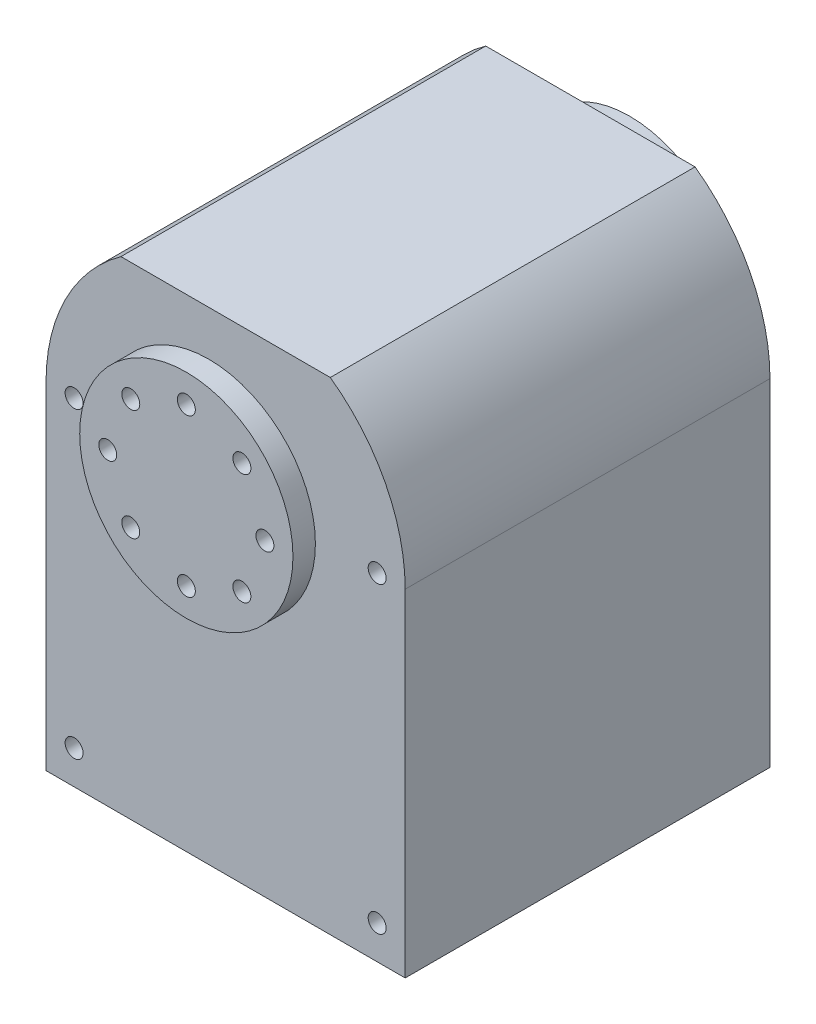
ISO-10303-21;
HEADER;
FILE_DESCRIPTION(('STEP AP214'),'2;1');
FILE_NAME('part.step','',(''),(''),'','','');
FILE_SCHEMA(('AUTOMOTIVE_DESIGN { 1 0 10303 214 1 1 1 1 }'));
ENDSEC;
DATA;
#1=APPLICATION_CONTEXT('core data for automotive mechanical design processes');
#2=APPLICATION_PROTOCOL_DEFINITION('international standard','automotive_design',2000,#1);
#3=PRODUCT_CONTEXT('',#1,'mechanical');
#4=PRODUCT('Part','Part','',(#3));
#5=PRODUCT_RELATED_PRODUCT_CATEGORY('part','',(#4));
#6=PRODUCT_DEFINITION_FORMATION('','',#4);
#7=PRODUCT_DEFINITION_CONTEXT('part definition',#1,'design');
#8=PRODUCT_DEFINITION('design','',#6,#7);
#9=PRODUCT_DEFINITION_SHAPE('','',#8);
#10=(LENGTH_UNIT() NAMED_UNIT(*) SI_UNIT(.MILLI.,.METRE.));
#11=(NAMED_UNIT(*) PLANE_ANGLE_UNIT() SI_UNIT($,.RADIAN.));
#12=(NAMED_UNIT(*) SI_UNIT($,.STERADIAN.) SOLID_ANGLE_UNIT());
#13=UNCERTAINTY_MEASURE_WITH_UNIT(LENGTH_MEASURE(1.E-05),#10,'distance_accuracy_value','');
#14=(GEOMETRIC_REPRESENTATION_CONTEXT(3) GLOBAL_UNCERTAINTY_ASSIGNED_CONTEXT((#13)) GLOBAL_UNIT_ASSIGNED_CONTEXT((#10,
#11,#12)) REPRESENTATION_CONTEXT('',''));
#15=CARTESIAN_POINT('',(0.,0.,0.));
#16=DIRECTION('',(0.,0.,1.));
#17=DIRECTION('',(1.,0.,0.));
#18=AXIS2_PLACEMENT_3D('',#15,#16,#17);
#19=CARTESIAN_POINT('',(0.,15.,32.5));
#20=DIRECTION('',(0.,0.,-1.));
#21=DIRECTION('',(-1.,0.,0.));
#22=AXIS2_PLACEMENT_3D('',#19,#20,#21);
#23=PLANE('',#22);
#24=CARTESIAN_POINT('',(0.,16.,32.5));
#25=DIRECTION('',(0.,0.,-1.));
#26=DIRECTION('',(-1.,0.,0.));
#27=AXIS2_PLACEMENT_3D('',#24,#25,#26);
#28=CIRCLE('',#27,4.5);
#29=CARTESIAN_POINT('',(-4.5,16.,32.5));
#30=VERTEX_POINT('',#29);
#31=EDGE_CURVE('E352',#30,#30,#28,.T.);
#32=ORIENTED_EDGE('',*,*,#31,.T.);
#33=EDGE_LOOP('',(#32));
#34=FACE_BOUND('',#33,.T.);
#35=CARTESIAN_POINT('',(0.,15.,32.5));
#36=DIRECTION('',(0.,0.,1.));
#37=DIRECTION('',(-1.,0.,0.));
#38=AXIS2_PLACEMENT_3D('',#35,#36,#37);
#39=CIRCLE('',#38,16.);
#40=CARTESIAN_POINT('',(-9.32737905308882,28.,32.5));
#41=VERTEX_POINT('',#40);
#42=CARTESIAN_POINT('',(-16.,15.,32.5));
#43=VERTEX_POINT('',#42);
#44=EDGE_CURVE('E134',#41,#43,#39,.T.);
#45=ORIENTED_EDGE('',*,*,#44,.T.);
#46=DIRECTION('',(0.,-1.,0.));
#47=VECTOR('',#46,1.);
#48=CARTESIAN_POINT('',(-16.,-15.,32.5));
#49=LINE('',#48,#47);
#50=CARTESIAN_POINT('',(-16.,-15.,32.5));
#51=VERTEX_POINT('',#50);
#52=EDGE_CURVE('E92',#43,#51,#49,.T.);
#53=ORIENTED_EDGE('',*,*,#52,.T.);
#54=DIRECTION('',(1.,0.,0.));
#55=VECTOR('',#54,1.);
#56=CARTESIAN_POINT('',(16.,-15.,32.5));
#57=LINE('',#56,#55);
#58=CARTESIAN_POINT('',(16.,-15.,32.5));
#59=VERTEX_POINT('',#58);
#60=EDGE_CURVE('E105',#51,#59,#57,.T.);
#61=ORIENTED_EDGE('',*,*,#60,.T.);
#62=DIRECTION('',(0.,1.,0.));
#63=VECTOR('',#62,1.);
#64=CARTESIAN_POINT('',(16.,-15.,32.5));
#65=LINE('',#64,#63);
#66=CARTESIAN_POINT('',(16.,15.,32.5));
#67=VERTEX_POINT('',#66);
#68=EDGE_CURVE('E99',#59,#67,#65,.T.);
#69=ORIENTED_EDGE('',*,*,#68,.T.);
#70=CARTESIAN_POINT('',(0.,15.,32.5));
#71=DIRECTION('',(0.,0.,1.));
#72=DIRECTION('',(-1.,0.,0.));
#73=AXIS2_PLACEMENT_3D('',#70,#71,#72);
#74=CIRCLE('',#73,16.);
#75=CARTESIAN_POINT('',(9.32737905308882,28.,32.5));
#76=VERTEX_POINT('',#75);
#77=EDGE_CURVE('E103',#67,#76,#74,.T.);
#78=ORIENTED_EDGE('',*,*,#77,.T.);
#79=DIRECTION('',(-1.,0.,0.));
#80=VECTOR('',#79,1.);
#81=CARTESIAN_POINT('',(-9.32737905308882,28.,32.5));
#82=LINE('',#81,#80);
#83=EDGE_CURVE('E55',#76,#41,#82,.T.);
#84=ORIENTED_EDGE('',*,*,#83,.T.);
#85=EDGE_LOOP('',(#45,#53,#61,#69,#78,#84));
#86=FACE_BOUND('',#85,.T.);
#87=CARTESIAN_POINT('',(13.5,-12.,32.5));
#88=DIRECTION('',(0.,0.,1.));
#89=DIRECTION('',(1.,0.,0.));
#90=AXIS2_PLACEMENT_3D('',#87,#88,#89);
#91=CIRCLE('',#90,0.800000000000001);
#92=CARTESIAN_POINT('',(14.3,-12.,32.5));
#93=VERTEX_POINT('',#92);
#94=EDGE_CURVE('E127',#93,#93,#91,.T.);
#95=ORIENTED_EDGE('',*,*,#94,.F.);
#96=EDGE_LOOP('',(#95));
#97=FACE_BOUND('',#96,.T.);
#98=CARTESIAN_POINT('',(-13.5,-12.,32.5));
#99=DIRECTION('',(0.,0.,1.));
#100=DIRECTION('',(1.,0.,0.));
#101=AXIS2_PLACEMENT_3D('',#98,#99,#100);
#102=CIRCLE('',#101,0.800000000000001);
#103=CARTESIAN_POINT('',(-12.7,-12.,32.5));
#104=VERTEX_POINT('',#103);
#105=EDGE_CURVE('E433',#104,#104,#102,.T.);
#106=ORIENTED_EDGE('',*,*,#105,.F.);
#107=EDGE_LOOP('',(#106));
#108=FACE_BOUND('',#107,.T.);
#109=CARTESIAN_POINT('',(13.5,15.,32.5));
#110=DIRECTION('',(0.,0.,1.));
#111=DIRECTION('',(1.,0.,0.));
#112=AXIS2_PLACEMENT_3D('',#109,#110,#111);
#113=CIRCLE('',#112,0.800000000000001);
#114=CARTESIAN_POINT('',(14.3,15.,32.5));
#115=VERTEX_POINT('',#114);
#116=EDGE_CURVE('E427',#115,#115,#113,.T.);
#117=ORIENTED_EDGE('',*,*,#116,.F.);
#118=EDGE_LOOP('',(#117));
#119=FACE_BOUND('',#118,.T.);
#120=CARTESIAN_POINT('',(-13.5,15.,32.5));
#121=DIRECTION('',(0.,0.,1.));
#122=DIRECTION('',(1.,0.,0.));
#123=AXIS2_PLACEMENT_3D('',#120,#121,#122);
#124=CIRCLE('',#123,0.800000000000001);
#125=CARTESIAN_POINT('',(-12.7,15.,32.5));
#126=VERTEX_POINT('',#125);
#127=EDGE_CURVE('E418',#126,#126,#124,.T.);
#128=ORIENTED_EDGE('',*,*,#127,.F.);
#129=EDGE_LOOP('',(#128));
#130=FACE_BOUND('',#129,.T.);
#131=ADVANCED_FACE('F37',(#34,#86,#97,#108,#119,#130),#23,.F.);
#132=CARTESIAN_POINT('',(0.,15.,0.));
#133=DIRECTION('',(0.,0.,-1.));
#134=DIRECTION('',(-1.,0.,0.));
#135=AXIS2_PLACEMENT_3D('',#132,#133,#134);
#136=PLANE('',#135);
#137=CARTESIAN_POINT('',(0.,16.,0.));
#138=DIRECTION('',(0.,0.,-1.));
#139=DIRECTION('',(-1.,0.,0.));
#140=AXIS2_PLACEMENT_3D('',#137,#138,#139);
#141=CIRCLE('',#140,4.5);
#142=CARTESIAN_POINT('',(-4.5,16.,0.));
#143=VERTEX_POINT('',#142);
#144=EDGE_CURVE('E409',#143,#143,#141,.T.);
#145=ORIENTED_EDGE('',*,*,#144,.F.);
#146=EDGE_LOOP('',(#145));
#147=FACE_BOUND('',#146,.T.);
#148=CARTESIAN_POINT('',(-13.5,-12.,0.));
#149=DIRECTION('',(0.,0.,1.));
#150=DIRECTION('',(1.,0.,0.));
#151=AXIS2_PLACEMENT_3D('',#148,#149,#150);
#152=CIRCLE('',#151,0.800000000000001);
#153=CARTESIAN_POINT('',(-12.7,-12.,0.));
#154=VERTEX_POINT('',#153);
#155=EDGE_CURVE('E430',#154,#154,#152,.T.);
#156=ORIENTED_EDGE('',*,*,#155,.T.);
#157=EDGE_LOOP('',(#156));
#158=FACE_BOUND('',#157,.T.);
#159=CARTESIAN_POINT('',(0.,15.,0.));
#160=DIRECTION('',(0.,0.,1.));
#161=DIRECTION('',(-1.,0.,0.));
#162=AXIS2_PLACEMENT_3D('',#159,#160,#161);
#163=CIRCLE('',#162,16.);
#164=CARTESIAN_POINT('',(-9.32737905308882,28.,0.));
#165=VERTEX_POINT('',#164);
#166=CARTESIAN_POINT('',(-16.,15.,0.));
#167=VERTEX_POINT('',#166);
#168=EDGE_CURVE('E123',#165,#167,#163,.T.);
#169=ORIENTED_EDGE('',*,*,#168,.F.);
#170=DIRECTION('',(-1.,0.,0.));
#171=VECTOR('',#170,1.);
#172=CARTESIAN_POINT('',(-9.32737905308882,28.,0.));
#173=LINE('',#172,#171);
#174=CARTESIAN_POINT('',(9.32737905308882,28.,0.));
#175=VERTEX_POINT('',#174);
#176=EDGE_CURVE('E84',#175,#165,#173,.T.);
#177=ORIENTED_EDGE('',*,*,#176,.F.);
#178=CARTESIAN_POINT('',(0.,15.,0.));
#179=DIRECTION('',(0.,0.,1.));
#180=DIRECTION('',(-1.,0.,0.));
#181=AXIS2_PLACEMENT_3D('',#178,#179,#180);
#182=CIRCLE('',#181,16.);
#183=CARTESIAN_POINT('',(16.,15.,0.));
#184=VERTEX_POINT('',#183);
#185=EDGE_CURVE('E78',#184,#175,#182,.T.);
#186=ORIENTED_EDGE('',*,*,#185,.F.);
#187=DIRECTION('',(0.,1.,0.));
#188=VECTOR('',#187,1.);
#189=CARTESIAN_POINT('',(16.,-15.,0.));
#190=LINE('',#189,#188);
#191=CARTESIAN_POINT('',(16.,-15.,0.));
#192=VERTEX_POINT('',#191);
#193=EDGE_CURVE('E113',#192,#184,#190,.T.);
#194=ORIENTED_EDGE('',*,*,#193,.F.);
#195=DIRECTION('',(1.,0.,0.));
#196=VECTOR('',#195,1.);
#197=CARTESIAN_POINT('',(16.,-15.,0.));
#198=LINE('',#197,#196);
#199=CARTESIAN_POINT('',(-16.,-15.,0.));
#200=VERTEX_POINT('',#199);
#201=EDGE_CURVE('E129',#200,#192,#198,.T.);
#202=ORIENTED_EDGE('',*,*,#201,.F.);
#203=DIRECTION('',(0.,-1.,0.));
#204=VECTOR('',#203,1.);
#205=CARTESIAN_POINT('',(-16.,-15.,0.));
#206=LINE('',#205,#204);
#207=EDGE_CURVE('E126',#167,#200,#206,.T.);
#208=ORIENTED_EDGE('',*,*,#207,.F.);
#209=EDGE_LOOP('',(#169,#177,#186,#194,#202,#208));
#210=FACE_BOUND('',#209,.T.);
#211=CARTESIAN_POINT('',(13.5,-12.,0.));
#212=DIRECTION('',(0.,0.,1.));
#213=DIRECTION('',(1.,0.,0.));
#214=AXIS2_PLACEMENT_3D('',#211,#212,#213);
#215=CIRCLE('',#214,0.800000000000001);
#216=CARTESIAN_POINT('',(14.3,-12.,0.));
#217=VERTEX_POINT('',#216);
#218=EDGE_CURVE('E436',#217,#217,#215,.T.);
#219=ORIENTED_EDGE('',*,*,#218,.T.);
#220=EDGE_LOOP('',(#219));
#221=FACE_BOUND('',#220,.T.);
#222=CARTESIAN_POINT('',(13.5,15.,0.));
#223=DIRECTION('',(0.,0.,1.));
#224=DIRECTION('',(1.,0.,0.));
#225=AXIS2_PLACEMENT_3D('',#222,#223,#224);
#226=CIRCLE('',#225,0.800000000000001);
#227=CARTESIAN_POINT('',(14.3,15.,0.));
#228=VERTEX_POINT('',#227);
#229=EDGE_CURVE('E426',#228,#228,#226,.T.);
#230=ORIENTED_EDGE('',*,*,#229,.T.);
#231=EDGE_LOOP('',(#230));
#232=FACE_BOUND('',#231,.T.);
#233=CARTESIAN_POINT('',(-13.5,15.,0.));
#234=DIRECTION('',(0.,0.,1.));
#235=DIRECTION('',(1.,0.,0.));
#236=AXIS2_PLACEMENT_3D('',#233,#234,#235);
#237=CIRCLE('',#236,0.800000000000001);
#238=CARTESIAN_POINT('',(-12.7,15.,0.));
#239=VERTEX_POINT('',#238);
#240=EDGE_CURVE('E415',#239,#239,#237,.T.);
#241=ORIENTED_EDGE('',*,*,#240,.T.);
#242=EDGE_LOOP('',(#241));
#243=FACE_BOUND('',#242,.T.);
#244=ADVANCED_FACE('F143',(#147,#158,#210,#221,#232,#243),#136,.T.);
#245=CARTESIAN_POINT('',(0.,15.,32.5));
#246=DIRECTION('',(0.,0.,-1.));
#247=DIRECTION('',(-1.,0.,0.));
#248=AXIS2_PLACEMENT_3D('',#245,#246,#247);
#249=CYLINDRICAL_SURFACE('',#248,16.);
#250=ORIENTED_EDGE('',*,*,#168,.T.);
#251=DIRECTION('',(0.,0.,-1.));
#252=VECTOR('',#251,1.);
#253=CARTESIAN_POINT('',(-16.,15.,32.5));
#254=LINE('',#253,#252);
#255=EDGE_CURVE('E11',#43,#167,#254,.T.);
#256=ORIENTED_EDGE('',*,*,#255,.F.);
#257=ORIENTED_EDGE('',*,*,#44,.F.);
#258=DIRECTION('',(0.,0.,-1.));
#259=VECTOR('',#258,1.);
#260=CARTESIAN_POINT('',(-9.32737905308882,28.,32.5));
#261=LINE('',#260,#259);
#262=EDGE_CURVE('E119',#41,#165,#261,.T.);
#263=ORIENTED_EDGE('',*,*,#262,.T.);
#264=EDGE_LOOP('',(#250,#256,#257,#263));
#265=FACE_BOUND('',#264,.T.);
#266=ADVANCED_FACE('F39',(#265),#249,.T.);
#267=CARTESIAN_POINT('',(-16.,-15.,32.5));
#268=DIRECTION('',(1.,0.,0.));
#269=DIRECTION('',(0.,0.,-1.));
#270=AXIS2_PLACEMENT_3D('',#267,#268,#269);
#271=PLANE('',#270);
#272=ORIENTED_EDGE('',*,*,#207,.T.);
#273=DIRECTION('',(0.,0.,-1.));
#274=VECTOR('',#273,1.);
#275=CARTESIAN_POINT('',(-16.,-15.,32.5));
#276=LINE('',#275,#274);
#277=EDGE_CURVE('E47',#51,#200,#276,.T.);
#278=ORIENTED_EDGE('',*,*,#277,.F.);
#279=ORIENTED_EDGE('',*,*,#52,.F.);
#280=ORIENTED_EDGE('',*,*,#255,.T.);
#281=EDGE_LOOP('',(#272,#278,#279,#280));
#282=FACE_BOUND('',#281,.T.);
#283=ADVANCED_FACE('F730',(#282),#271,.F.);
#284=CARTESIAN_POINT('',(16.,-15.,32.5));
#285=DIRECTION('',(0.,1.,0.));
#286=DIRECTION('',(-1.,0.,0.));
#287=AXIS2_PLACEMENT_3D('',#284,#285,#286);
#288=PLANE('',#287);
#289=ORIENTED_EDGE('',*,*,#201,.T.);
#290=DIRECTION('',(0.,0.,-1.));
#291=VECTOR('',#290,1.);
#292=CARTESIAN_POINT('',(16.,-15.,32.5));
#293=LINE('',#292,#291);
#294=EDGE_CURVE('E114',#59,#192,#293,.T.);
#295=ORIENTED_EDGE('',*,*,#294,.F.);
#296=ORIENTED_EDGE('',*,*,#60,.F.);
#297=ORIENTED_EDGE('',*,*,#277,.T.);
#298=EDGE_LOOP('',(#289,#295,#296,#297));
#299=FACE_BOUND('',#298,.T.);
#300=ADVANCED_FACE('F140',(#299),#288,.F.);
#301=CARTESIAN_POINT('',(16.,-15.,32.5));
#302=DIRECTION('',(-1.,0.,0.));
#303=DIRECTION('',(0.,-1.,0.));
#304=AXIS2_PLACEMENT_3D('',#301,#302,#303);
#305=PLANE('',#304);
#306=ORIENTED_EDGE('',*,*,#193,.T.);
#307=DIRECTION('',(0.,0.,-1.));
#308=VECTOR('',#307,1.);
#309=CARTESIAN_POINT('',(16.,15.,32.5));
#310=LINE('',#309,#308);
#311=EDGE_CURVE('E110',#67,#184,#310,.T.);
#312=ORIENTED_EDGE('',*,*,#311,.F.);
#313=ORIENTED_EDGE('',*,*,#68,.F.);
#314=ORIENTED_EDGE('',*,*,#294,.T.);
#315=EDGE_LOOP('',(#306,#312,#313,#314));
#316=FACE_BOUND('',#315,.T.);
#317=ADVANCED_FACE('F111',(#316),#305,.F.);
#318=CARTESIAN_POINT('',(0.,15.,32.5));
#319=DIRECTION('',(0.,0.,-1.));
#320=DIRECTION('',(-1.,0.,0.));
#321=AXIS2_PLACEMENT_3D('',#318,#319,#320);
#322=CYLINDRICAL_SURFACE('',#321,16.);
#323=ORIENTED_EDGE('',*,*,#185,.T.);
#324=DIRECTION('',(0.,0.,-1.));
#325=VECTOR('',#324,1.);
#326=CARTESIAN_POINT('',(9.32737905308882,28.,32.5));
#327=LINE('',#326,#325);
#328=EDGE_CURVE('E115',#76,#175,#327,.T.);
#329=ORIENTED_EDGE('',*,*,#328,.F.);
#330=ORIENTED_EDGE('',*,*,#77,.F.);
#331=ORIENTED_EDGE('',*,*,#311,.T.);
#332=EDGE_LOOP('',(#323,#329,#330,#331));
#333=FACE_BOUND('',#332,.T.);
#334=ADVANCED_FACE('F117',(#333),#322,.T.);
#335=CARTESIAN_POINT('',(-9.32737905308882,28.,32.5));
#336=DIRECTION('',(0.,-1.,0.));
#337=DIRECTION('',(1.,0.,0.));
#338=AXIS2_PLACEMENT_3D('',#335,#336,#337);
#339=PLANE('',#338);
#340=ORIENTED_EDGE('',*,*,#176,.T.);
#341=ORIENTED_EDGE('',*,*,#262,.F.);
#342=ORIENTED_EDGE('',*,*,#83,.F.);
#343=ORIENTED_EDGE('',*,*,#328,.T.);
#344=EDGE_LOOP('',(#340,#341,#342,#343));
#345=FACE_BOUND('',#344,.T.);
#346=ADVANCED_FACE('F148',(#345),#339,.F.);
#347=CARTESIAN_POINT('',(13.5,-12.,32.5));
#348=DIRECTION('',(0.,0.,-1.));
#349=DIRECTION('',(-1.,0.,0.));
#350=AXIS2_PLACEMENT_3D('',#347,#348,#349);
#351=CYLINDRICAL_SURFACE('',#350,0.800000000000001);
#352=ORIENTED_EDGE('',*,*,#94,.T.);
#353=EDGE_LOOP('',(#352));
#354=FACE_BOUND('',#353,.T.);
#355=ORIENTED_EDGE('',*,*,#218,.F.);
#356=EDGE_LOOP('',(#355));
#357=FACE_BOUND('',#356,.T.);
#358=ADVANCED_FACE('F150',(#354,#357),#351,.F.);
#359=CARTESIAN_POINT('',(-13.5,-12.,32.5));
#360=DIRECTION('',(0.,0.,-1.));
#361=DIRECTION('',(-1.,0.,0.));
#362=AXIS2_PLACEMENT_3D('',#359,#360,#361);
#363=CYLINDRICAL_SURFACE('',#362,0.800000000000001);
#364=ORIENTED_EDGE('',*,*,#105,.T.);
#365=EDGE_LOOP('',(#364));
#366=FACE_BOUND('',#365,.T.);
#367=ORIENTED_EDGE('',*,*,#155,.F.);
#368=EDGE_LOOP('',(#367));
#369=FACE_BOUND('',#368,.T.);
#370=ADVANCED_FACE('F156',(#366,#369),#363,.F.);
#371=CARTESIAN_POINT('',(13.5,15.,32.5));
#372=DIRECTION('',(0.,0.,-1.));
#373=DIRECTION('',(-1.,0.,0.));
#374=AXIS2_PLACEMENT_3D('',#371,#372,#373);
#375=CYLINDRICAL_SURFACE('',#374,0.800000000000001);
#376=ORIENTED_EDGE('',*,*,#116,.T.);
#377=EDGE_LOOP('',(#376));
#378=FACE_BOUND('',#377,.T.);
#379=ORIENTED_EDGE('',*,*,#229,.F.);
#380=EDGE_LOOP('',(#379));
#381=FACE_BOUND('',#380,.T.);
#382=ADVANCED_FACE('F172',(#378,#381),#375,.F.);
#383=CARTESIAN_POINT('',(-13.5,15.,32.5));
#384=DIRECTION('',(0.,0.,-1.));
#385=DIRECTION('',(-1.,0.,0.));
#386=AXIS2_PLACEMENT_3D('',#383,#384,#385);
#387=CYLINDRICAL_SURFACE('',#386,0.800000000000001);
#388=ORIENTED_EDGE('',*,*,#127,.T.);
#389=EDGE_LOOP('',(#388));
#390=FACE_BOUND('',#389,.T.);
#391=ORIENTED_EDGE('',*,*,#240,.F.);
#392=EDGE_LOOP('',(#391));
#393=FACE_BOUND('',#392,.T.);
#394=ADVANCED_FACE('F176',(#390,#393),#387,.F.);
#395=CARTESIAN_POINT('',(0.,16.,-1.5));
#396=DIRECTION('',(0.,0.,1.));
#397=DIRECTION('',(1.,0.,0.));
#398=AXIS2_PLACEMENT_3D('',#395,#396,#397);
#399=CYLINDRICAL_SURFACE('',#398,4.5);
#400=CARTESIAN_POINT('',(0.,16.,-1.5));
#401=DIRECTION('',(0.,0.,-1.));
#402=DIRECTION('',(-1.,0.,0.));
#403=AXIS2_PLACEMENT_3D('',#400,#401,#402);
#404=CIRCLE('',#403,4.5);
#405=CARTESIAN_POINT('',(-4.5,16.,-1.5));
#406=VERTEX_POINT('',#405);
#407=EDGE_CURVE('E412',#406,#406,#404,.T.);
#408=ORIENTED_EDGE('',*,*,#407,.F.);
#409=EDGE_LOOP('',(#408));
#410=FACE_BOUND('',#409,.T.);
#411=ORIENTED_EDGE('',*,*,#144,.T.);
#412=EDGE_LOOP('',(#411));
#413=FACE_BOUND('',#412,.T.);
#414=ADVANCED_FACE('F187',(#410,#413),#399,.T.);
#415=CARTESIAN_POINT('',(0.,16.,-3.5));
#416=DIRECTION('',(0.,0.,1.));
#417=DIRECTION('',(1.,0.,0.));
#418=AXIS2_PLACEMENT_3D('',#415,#416,#417);
#419=CYLINDRICAL_SURFACE('',#418,9.5);
#420=CARTESIAN_POINT('',(0.,16.,-3.5));
#421=DIRECTION('',(0.,0.,-1.));
#422=DIRECTION('',(-1.,0.,0.));
#423=AXIS2_PLACEMENT_3D('',#420,#421,#422);
#424=CIRCLE('',#423,9.5);
#425=CARTESIAN_POINT('',(-9.5,16.,-3.5));
#426=VERTEX_POINT('',#425);
#427=EDGE_CURVE('E406',#426,#426,#424,.T.);
#428=ORIENTED_EDGE('',*,*,#427,.F.);
#429=EDGE_LOOP('',(#428));
#430=FACE_BOUND('',#429,.T.);
#431=CARTESIAN_POINT('',(0.,16.,-1.5));
#432=DIRECTION('',(0.,0.,-1.));
#433=DIRECTION('',(-1.,0.,0.));
#434=AXIS2_PLACEMENT_3D('',#431,#432,#433);
#435=CIRCLE('',#434,9.5);
#436=CARTESIAN_POINT('',(-9.5,16.,-1.5));
#437=VERTEX_POINT('',#436);
#438=EDGE_CURVE('E365',#437,#437,#435,.T.);
#439=ORIENTED_EDGE('',*,*,#438,.T.);
#440=EDGE_LOOP('',(#439));
#441=FACE_BOUND('',#440,.T.);
#442=ADVANCED_FACE('F191',(#430,#441),#419,.T.);
#443=CARTESIAN_POINT('',(0.,16.,-3.5));
#444=DIRECTION('',(0.,0.,-1.));
#445=DIRECTION('',(-1.,0.,0.));
#446=AXIS2_PLACEMENT_3D('',#443,#444,#445);
#447=PLANE('',#446);
#448=CARTESIAN_POINT('',(0.,23.,-3.5));
#449=DIRECTION('',(0.,0.,-1.));
#450=DIRECTION('',(-1.,0.,0.));
#451=AXIS2_PLACEMENT_3D('',#448,#449,#450);
#452=CIRCLE('',#451,0.799999999999999);
#453=CARTESIAN_POINT('',(-0.799999999999999,23.,-3.5));
#454=VERTEX_POINT('',#453);
#455=EDGE_CURVE('E358',#454,#454,#452,.T.);
#456=ORIENTED_EDGE('',*,*,#455,.F.);
#457=EDGE_LOOP('',(#456));
#458=FACE_BOUND('',#457,.T.);
#459=CARTESIAN_POINT('',(-4.94974746830583,20.9497474683058,-3.5));
#460=DIRECTION('',(0.,0.,-1.));
#461=DIRECTION('',(-1.,0.,0.));
#462=AXIS2_PLACEMENT_3D('',#459,#460,#461);
#463=CIRCLE('',#462,0.799999999999981);
#464=CARTESIAN_POINT('',(-5.74974746830581,20.9497474683058,-3.5));
#465=VERTEX_POINT('',#464);
#466=EDGE_CURVE('E366',#465,#465,#463,.T.);
#467=ORIENTED_EDGE('',*,*,#466,.F.);
#468=EDGE_LOOP('',(#467));
#469=FACE_BOUND('',#468,.T.);
#470=CARTESIAN_POINT('',(-7.,16.,-3.5));
#471=DIRECTION('',(0.,0.,-1.));
#472=DIRECTION('',(-1.,0.,0.));
#473=AXIS2_PLACEMENT_3D('',#470,#471,#472);
#474=CIRCLE('',#473,0.79999999999969);
#475=CARTESIAN_POINT('',(-7.79999999999969,16.,-3.5));
#476=VERTEX_POINT('',#475);
#477=EDGE_CURVE('E372',#476,#476,#474,.T.);
#478=ORIENTED_EDGE('',*,*,#477,.F.);
#479=EDGE_LOOP('',(#478));
#480=FACE_BOUND('',#479,.T.);
#481=CARTESIAN_POINT('',(-4.94974746830583,11.0502525316942,-3.5));
#482=DIRECTION('',(0.,0.,-1.));
#483=DIRECTION('',(-1.,0.,0.));
#484=AXIS2_PLACEMENT_3D('',#481,#482,#483);
#485=CIRCLE('',#484,0.799999999999331);
#486=CARTESIAN_POINT('',(-5.74974746830516,11.0502525316942,-3.5));
#487=VERTEX_POINT('',#486);
#488=EDGE_CURVE('E378',#487,#487,#485,.T.);
#489=ORIENTED_EDGE('',*,*,#488,.F.);
#490=EDGE_LOOP('',(#489));
#491=FACE_BOUND('',#490,.T.);
#492=CARTESIAN_POINT('',(0.,8.99999999999999,-3.5));
#493=DIRECTION('',(0.,0.,-1.));
#494=DIRECTION('',(-1.,0.,0.));
#495=AXIS2_PLACEMENT_3D('',#492,#493,#494);
#496=CIRCLE('',#495,0.799999999999097);
#497=CARTESIAN_POINT('',(-0.799999999999098,8.99999999999999,-3.5));
#498=VERTEX_POINT('',#497);
#499=EDGE_CURVE('E384',#498,#498,#496,.T.);
#500=ORIENTED_EDGE('',*,*,#499,.F.);
#501=EDGE_LOOP('',(#500));
#502=FACE_BOUND('',#501,.T.);
#503=CARTESIAN_POINT('',(4.94974746830583,11.0502525316942,-3.5));
#504=DIRECTION('',(0.,0.,-1.));
#505=DIRECTION('',(-1.,0.,0.));
#506=AXIS2_PLACEMENT_3D('',#503,#504,#505);
#507=CIRCLE('',#506,0.799999999999145);
#508=CARTESIAN_POINT('',(4.14974746830669,11.0502525316942,-3.5));
#509=VERTEX_POINT('',#508);
#510=EDGE_CURVE('E390',#509,#509,#507,.T.);
#511=ORIENTED_EDGE('',*,*,#510,.F.);
#512=EDGE_LOOP('',(#511));
#513=FACE_BOUND('',#512,.T.);
#514=CARTESIAN_POINT('',(7.,16.,-3.5));
#515=DIRECTION('',(0.,0.,-1.));
#516=DIRECTION('',(-1.,0.,0.));
#517=AXIS2_PLACEMENT_3D('',#514,#515,#516);
#518=CIRCLE('',#517,0.79999999999945);
#519=CARTESIAN_POINT('',(6.20000000000055,16.,-3.5));
#520=VERTEX_POINT('',#519);
#521=EDGE_CURVE('E396',#520,#520,#518,.T.);
#522=ORIENTED_EDGE('',*,*,#521,.F.);
#523=EDGE_LOOP('',(#522));
#524=FACE_BOUND('',#523,.T.);
#525=CARTESIAN_POINT('',(4.94974746830583,20.9497474683058,-3.5));
#526=DIRECTION('',(0.,0.,-1.));
#527=DIRECTION('',(-1.,0.,0.));
#528=AXIS2_PLACEMENT_3D('',#525,#526,#527);
#529=CIRCLE('',#528,0.799999999999842);
#530=CARTESIAN_POINT('',(4.14974746830599,20.9497474683058,-3.5));
#531=VERTEX_POINT('',#530);
#532=EDGE_CURVE('E357',#531,#531,#529,.T.);
#533=ORIENTED_EDGE('',*,*,#532,.F.);
#534=EDGE_LOOP('',(#533));
#535=FACE_BOUND('',#534,.T.);
#536=ORIENTED_EDGE('',*,*,#427,.T.);
#537=EDGE_LOOP('',(#536));
#538=FACE_BOUND('',#537,.T.);
#539=ADVANCED_FACE('F198',(#458,#469,#480,#491,#502,#513,#524,#535,#538),#447,.T.);
#540=CARTESIAN_POINT('',(0.,16.,-1.5));
#541=DIRECTION('',(0.,0.,-1.));
#542=DIRECTION('',(-1.,0.,0.));
#543=AXIS2_PLACEMENT_3D('',#540,#541,#542);
#544=PLANE('',#543);
#545=CARTESIAN_POINT('',(0.,23.,-1.5));
#546=DIRECTION('',(0.,0.,-1.));
#547=DIRECTION('',(-1.,0.,0.));
#548=AXIS2_PLACEMENT_3D('',#545,#546,#547);
#549=CIRCLE('',#548,0.799999999999999);
#550=CARTESIAN_POINT('',(-0.799999999999999,23.,-1.5));
#551=VERTEX_POINT('',#550);
#552=EDGE_CURVE('E361',#551,#551,#549,.F.);
#553=ORIENTED_EDGE('',*,*,#552,.F.);
#554=EDGE_LOOP('',(#553));
#555=FACE_BOUND('',#554,.T.);
#556=CARTESIAN_POINT('',(-4.94974746830583,20.9497474683058,-1.5));
#557=DIRECTION('',(0.,0.,-1.));
#558=DIRECTION('',(-1.,0.,0.));
#559=AXIS2_PLACEMENT_3D('',#556,#557,#558);
#560=CIRCLE('',#559,0.799999999999981);
#561=CARTESIAN_POINT('',(-5.74974746830581,20.9497474683058,-1.5));
#562=VERTEX_POINT('',#561);
#563=EDGE_CURVE('E362',#562,#562,#560,.F.);
#564=ORIENTED_EDGE('',*,*,#563,.F.);
#565=EDGE_LOOP('',(#564));
#566=FACE_BOUND('',#565,.T.);
#567=CARTESIAN_POINT('',(-7.,16.,-1.5));
#568=DIRECTION('',(0.,0.,-1.));
#569=DIRECTION('',(-1.,0.,0.));
#570=AXIS2_PLACEMENT_3D('',#567,#568,#569);
#571=CIRCLE('',#570,0.79999999999969);
#572=CARTESIAN_POINT('',(-7.79999999999969,16.,-1.5));
#573=VERTEX_POINT('',#572);
#574=EDGE_CURVE('E369',#573,#573,#571,.F.);
#575=ORIENTED_EDGE('',*,*,#574,.F.);
#576=EDGE_LOOP('',(#575));
#577=FACE_BOUND('',#576,.T.);
#578=CARTESIAN_POINT('',(-4.94974746830583,11.0502525316942,-1.5));
#579=DIRECTION('',(0.,0.,-1.));
#580=DIRECTION('',(-1.,0.,0.));
#581=AXIS2_PLACEMENT_3D('',#578,#579,#580);
#582=CIRCLE('',#581,0.799999999999331);
#583=CARTESIAN_POINT('',(-5.74974746830516,11.0502525316942,-1.5));
#584=VERTEX_POINT('',#583);
#585=EDGE_CURVE('E375',#584,#584,#582,.F.);
#586=ORIENTED_EDGE('',*,*,#585,.F.);
#587=EDGE_LOOP('',(#586));
#588=FACE_BOUND('',#587,.T.);
#589=CARTESIAN_POINT('',(0.,8.99999999999999,-1.5));
#590=DIRECTION('',(0.,0.,-1.));
#591=DIRECTION('',(-1.,0.,0.));
#592=AXIS2_PLACEMENT_3D('',#589,#590,#591);
#593=CIRCLE('',#592,0.799999999999097);
#594=CARTESIAN_POINT('',(-0.799999999999098,8.99999999999999,-1.5));
#595=VERTEX_POINT('',#594);
#596=EDGE_CURVE('E381',#595,#595,#593,.F.);
#597=ORIENTED_EDGE('',*,*,#596,.F.);
#598=EDGE_LOOP('',(#597));
#599=FACE_BOUND('',#598,.T.);
#600=CARTESIAN_POINT('',(4.94974746830583,11.0502525316942,-1.5));
#601=DIRECTION('',(0.,0.,-1.));
#602=DIRECTION('',(-1.,0.,0.));
#603=AXIS2_PLACEMENT_3D('',#600,#601,#602);
#604=CIRCLE('',#603,0.799999999999145);
#605=CARTESIAN_POINT('',(4.14974746830669,11.0502525316942,-1.5));
#606=VERTEX_POINT('',#605);
#607=EDGE_CURVE('E387',#606,#606,#604,.F.);
#608=ORIENTED_EDGE('',*,*,#607,.F.);
#609=EDGE_LOOP('',(#608));
#610=FACE_BOUND('',#609,.T.);
#611=CARTESIAN_POINT('',(7.,16.,-1.5));
#612=DIRECTION('',(0.,0.,-1.));
#613=DIRECTION('',(-1.,0.,0.));
#614=AXIS2_PLACEMENT_3D('',#611,#612,#613);
#615=CIRCLE('',#614,0.79999999999945);
#616=CARTESIAN_POINT('',(6.20000000000055,16.,-1.5));
#617=VERTEX_POINT('',#616);
#618=EDGE_CURVE('E393',#617,#617,#615,.F.);
#619=ORIENTED_EDGE('',*,*,#618,.F.);
#620=EDGE_LOOP('',(#619));
#621=FACE_BOUND('',#620,.T.);
#622=CARTESIAN_POINT('',(4.94974746830583,20.9497474683058,-1.5));
#623=DIRECTION('',(0.,0.,-1.));
#624=DIRECTION('',(-1.,0.,0.));
#625=AXIS2_PLACEMENT_3D('',#622,#623,#624);
#626=CIRCLE('',#625,0.799999999999842);
#627=CARTESIAN_POINT('',(4.14974746830599,20.9497474683058,-1.5));
#628=VERTEX_POINT('',#627);
#629=EDGE_CURVE('E399',#628,#628,#626,.F.);
#630=ORIENTED_EDGE('',*,*,#629,.F.);
#631=EDGE_LOOP('',(#630));
#632=FACE_BOUND('',#631,.T.);
#633=ORIENTED_EDGE('',*,*,#407,.T.);
#634=EDGE_LOOP('',(#633));
#635=FACE_BOUND('',#634,.T.);
#636=ORIENTED_EDGE('',*,*,#438,.F.);
#637=EDGE_LOOP('',(#636));
#638=FACE_BOUND('',#637,.T.);
#639=ADVANCED_FACE('F200',(#555,#566,#577,#588,#599,#610,#621,#632,#635,#638),#544,.F.);
#640=CARTESIAN_POINT('',(4.94974746830583,20.9497474683058,32.501));
#641=DIRECTION('',(0.,0.,-1.));
#642=DIRECTION('',(-1.,0.,0.));
#643=AXIS2_PLACEMENT_3D('',#640,#641,#642);
#644=CYLINDRICAL_SURFACE('',#643,0.799999999999842);
#645=ORIENTED_EDGE('',*,*,#532,.T.);
#646=EDGE_LOOP('',(#645));
#647=FACE_BOUND('',#646,.T.);
#648=ORIENTED_EDGE('',*,*,#629,.T.);
#649=EDGE_LOOP('',(#648));
#650=FACE_BOUND('',#649,.T.);
#651=ADVANCED_FACE('F203',(#647,#650),#644,.F.);
#652=CARTESIAN_POINT('',(7.,16.,32.501));
#653=DIRECTION('',(0.,0.,-1.));
#654=DIRECTION('',(-1.,0.,0.));
#655=AXIS2_PLACEMENT_3D('',#652,#653,#654);
#656=CYLINDRICAL_SURFACE('',#655,0.79999999999945);
#657=ORIENTED_EDGE('',*,*,#521,.T.);
#658=EDGE_LOOP('',(#657));
#659=FACE_BOUND('',#658,.T.);
#660=ORIENTED_EDGE('',*,*,#618,.T.);
#661=EDGE_LOOP('',(#660));
#662=FACE_BOUND('',#661,.T.);
#663=ADVANCED_FACE('F210',(#659,#662),#656,.F.);
#664=CARTESIAN_POINT('',(4.94974746830583,11.0502525316942,32.501));
#665=DIRECTION('',(0.,0.,-1.));
#666=DIRECTION('',(-1.,0.,0.));
#667=AXIS2_PLACEMENT_3D('',#664,#665,#666);
#668=CYLINDRICAL_SURFACE('',#667,0.799999999999145);
#669=ORIENTED_EDGE('',*,*,#510,.T.);
#670=EDGE_LOOP('',(#669));
#671=FACE_BOUND('',#670,.T.);
#672=ORIENTED_EDGE('',*,*,#607,.T.);
#673=EDGE_LOOP('',(#672));
#674=FACE_BOUND('',#673,.T.);
#675=ADVANCED_FACE('F214',(#671,#674),#668,.F.);
#676=CARTESIAN_POINT('',(0.,8.99999999999999,32.501));
#677=DIRECTION('',(0.,0.,-1.));
#678=DIRECTION('',(-1.,0.,0.));
#679=AXIS2_PLACEMENT_3D('',#676,#677,#678);
#680=CYLINDRICAL_SURFACE('',#679,0.799999999999097);
#681=ORIENTED_EDGE('',*,*,#499,.T.);
#682=EDGE_LOOP('',(#681));
#683=FACE_BOUND('',#682,.T.);
#684=ORIENTED_EDGE('',*,*,#596,.T.);
#685=EDGE_LOOP('',(#684));
#686=FACE_BOUND('',#685,.T.);
#687=ADVANCED_FACE('F218',(#683,#686),#680,.F.);
#688=CARTESIAN_POINT('',(-4.94974746830583,11.0502525316942,32.501));
#689=DIRECTION('',(0.,0.,-1.));
#690=DIRECTION('',(-1.,0.,0.));
#691=AXIS2_PLACEMENT_3D('',#688,#689,#690);
#692=CYLINDRICAL_SURFACE('',#691,0.799999999999331);
#693=ORIENTED_EDGE('',*,*,#488,.T.);
#694=EDGE_LOOP('',(#693));
#695=FACE_BOUND('',#694,.T.);
#696=ORIENTED_EDGE('',*,*,#585,.T.);
#697=EDGE_LOOP('',(#696));
#698=FACE_BOUND('',#697,.T.);
#699=ADVANCED_FACE('F222',(#695,#698),#692,.F.);
#700=CARTESIAN_POINT('',(-7.,16.,32.501));
#701=DIRECTION('',(0.,0.,-1.));
#702=DIRECTION('',(-1.,0.,0.));
#703=AXIS2_PLACEMENT_3D('',#700,#701,#702);
#704=CYLINDRICAL_SURFACE('',#703,0.79999999999969);
#705=ORIENTED_EDGE('',*,*,#477,.T.);
#706=EDGE_LOOP('',(#705));
#707=FACE_BOUND('',#706,.T.);
#708=ORIENTED_EDGE('',*,*,#574,.T.);
#709=EDGE_LOOP('',(#708));
#710=FACE_BOUND('',#709,.T.);
#711=ADVANCED_FACE('F226',(#707,#710),#704,.F.);
#712=CARTESIAN_POINT('',(-4.94974746830583,20.9497474683058,32.501));
#713=DIRECTION('',(0.,0.,-1.));
#714=DIRECTION('',(-1.,0.,0.));
#715=AXIS2_PLACEMENT_3D('',#712,#713,#714);
#716=CYLINDRICAL_SURFACE('',#715,0.799999999999981);
#717=ORIENTED_EDGE('',*,*,#466,.T.);
#718=EDGE_LOOP('',(#717));
#719=FACE_BOUND('',#718,.T.);
#720=ORIENTED_EDGE('',*,*,#563,.T.);
#721=EDGE_LOOP('',(#720));
#722=FACE_BOUND('',#721,.T.);
#723=ADVANCED_FACE('F230',(#719,#722),#716,.F.);
#724=CARTESIAN_POINT('',(0.,23.,32.501));
#725=DIRECTION('',(0.,0.,-1.));
#726=DIRECTION('',(-1.,0.,0.));
#727=AXIS2_PLACEMENT_3D('',#724,#725,#726);
#728=CYLINDRICAL_SURFACE('',#727,0.799999999999999);
#729=ORIENTED_EDGE('',*,*,#455,.T.);
#730=EDGE_LOOP('',(#729));
#731=FACE_BOUND('',#730,.T.);
#732=ORIENTED_EDGE('',*,*,#552,.T.);
#733=EDGE_LOOP('',(#732));
#734=FACE_BOUND('',#733,.T.);
#735=ADVANCED_FACE('F234',(#731,#734),#728,.F.);
#736=CARTESIAN_POINT('',(0.,16.,34.));
#737=DIRECTION('',(0.,0.,-1.));
#738=DIRECTION('',(-1.,0.,0.));
#739=AXIS2_PLACEMENT_3D('',#736,#737,#738);
#740=CYLINDRICAL_SURFACE('',#739,4.5);
#741=CARTESIAN_POINT('',(0.,16.,34.));
#742=DIRECTION('',(0.,0.,-1.));
#743=DIRECTION('',(-1.,0.,0.));
#744=AXIS2_PLACEMENT_3D('',#741,#742,#743);
#745=CIRCLE('',#744,4.5);
#746=CARTESIAN_POINT('',(-4.5,16.,34.));
#747=VERTEX_POINT('',#746);
#748=EDGE_CURVE('E348',#747,#747,#745,.T.);
#749=ORIENTED_EDGE('',*,*,#748,.T.);
#750=EDGE_LOOP('',(#749));
#751=FACE_BOUND('',#750,.T.);
#752=ORIENTED_EDGE('',*,*,#31,.F.);
#753=EDGE_LOOP('',(#752));
#754=FACE_BOUND('',#753,.T.);
#755=ADVANCED_FACE('F238',(#751,#754),#740,.T.);
#756=CARTESIAN_POINT('',(0.,16.,36.));
#757=DIRECTION('',(0.,0.,-1.));
#758=DIRECTION('',(-1.,0.,0.));
#759=AXIS2_PLACEMENT_3D('',#756,#757,#758);
#760=CYLINDRICAL_SURFACE('',#759,9.5);
#761=CARTESIAN_POINT('',(0.,16.,36.));
#762=DIRECTION('',(0.,0.,-1.));
#763=DIRECTION('',(-1.,0.,0.));
#764=AXIS2_PLACEMENT_3D('',#761,#762,#763);
#765=CIRCLE('',#764,9.5);
#766=CARTESIAN_POINT('',(-9.5,16.,36.));
#767=VERTEX_POINT('',#766);
#768=EDGE_CURVE('E301',#767,#767,#765,.T.);
#769=ORIENTED_EDGE('',*,*,#768,.T.);
#770=EDGE_LOOP('',(#769));
#771=FACE_BOUND('',#770,.T.);
#772=CARTESIAN_POINT('',(0.,16.,34.));
#773=DIRECTION('',(0.,0.,-1.));
#774=DIRECTION('',(-1.,0.,0.));
#775=AXIS2_PLACEMENT_3D('',#772,#773,#774);
#776=CIRCLE('',#775,9.5);
#777=CARTESIAN_POINT('',(-9.5,16.,34.));
#778=VERTEX_POINT('',#777);
#779=EDGE_CURVE('E298',#778,#778,#776,.T.);
#780=ORIENTED_EDGE('',*,*,#779,.F.);
#781=EDGE_LOOP('',(#780));
#782=FACE_BOUND('',#781,.T.);
#783=ADVANCED_FACE('F242',(#771,#782),#760,.T.);
#784=CARTESIAN_POINT('',(0.,16.,36.));
#785=DIRECTION('',(0.,0.,1.));
#786=DIRECTION('',(-1.,0.,0.));
#787=AXIS2_PLACEMENT_3D('',#784,#785,#786);
#788=PLANE('',#787);
#789=CARTESIAN_POINT('',(0.,23.,36.));
#790=DIRECTION('',(0.,0.,-1.));
#791=DIRECTION('',(-1.,0.,0.));
#792=AXIS2_PLACEMENT_3D('',#789,#790,#791);
#793=CIRCLE('',#792,0.799999999999999);
#794=CARTESIAN_POINT('',(-0.799999999999999,23.,36.));
#795=VERTEX_POINT('',#794);
#796=EDGE_CURVE('E294',#795,#795,#793,.T.);
#797=ORIENTED_EDGE('',*,*,#796,.T.);
#798=EDGE_LOOP('',(#797));
#799=FACE_BOUND('',#798,.T.);
#800=CARTESIAN_POINT('',(-4.94974746830583,20.9497474683058,36.));
#801=DIRECTION('',(0.,0.,-1.));
#802=DIRECTION('',(-1.,0.,0.));
#803=AXIS2_PLACEMENT_3D('',#800,#801,#802);
#804=CIRCLE('',#803,0.799999999999981);
#805=CARTESIAN_POINT('',(-5.74974746830581,20.9497474683058,36.));
#806=VERTEX_POINT('',#805);
#807=EDGE_CURVE('E308',#806,#806,#804,.T.);
#808=ORIENTED_EDGE('',*,*,#807,.T.);
#809=EDGE_LOOP('',(#808));
#810=FACE_BOUND('',#809,.T.);
#811=CARTESIAN_POINT('',(-7.,16.,36.));
#812=DIRECTION('',(0.,0.,-1.));
#813=DIRECTION('',(-1.,0.,0.));
#814=AXIS2_PLACEMENT_3D('',#811,#812,#813);
#815=CIRCLE('',#814,0.79999999999969);
#816=CARTESIAN_POINT('',(-7.79999999999969,16.,36.));
#817=VERTEX_POINT('',#816);
#818=EDGE_CURVE('E314',#817,#817,#815,.T.);
#819=ORIENTED_EDGE('',*,*,#818,.T.);
#820=EDGE_LOOP('',(#819));
#821=FACE_BOUND('',#820,.T.);
#822=CARTESIAN_POINT('',(-4.94974746830583,11.0502525316942,36.));
#823=DIRECTION('',(0.,0.,-1.));
#824=DIRECTION('',(-1.,0.,0.));
#825=AXIS2_PLACEMENT_3D('',#822,#823,#824);
#826=CIRCLE('',#825,0.799999999999331);
#827=CARTESIAN_POINT('',(-5.74974746830516,11.0502525316942,36.));
#828=VERTEX_POINT('',#827);
#829=EDGE_CURVE('E320',#828,#828,#826,.T.);
#830=ORIENTED_EDGE('',*,*,#829,.T.);
#831=EDGE_LOOP('',(#830));
#832=FACE_BOUND('',#831,.T.);
#833=CARTESIAN_POINT('',(0.,8.99999999999999,36.));
#834=DIRECTION('',(0.,0.,-1.));
#835=DIRECTION('',(-1.,0.,0.));
#836=AXIS2_PLACEMENT_3D('',#833,#834,#835);
#837=CIRCLE('',#836,0.799999999999097);
#838=CARTESIAN_POINT('',(-0.799999999999098,8.99999999999999,36.));
#839=VERTEX_POINT('',#838);
#840=EDGE_CURVE('E326',#839,#839,#837,.T.);
#841=ORIENTED_EDGE('',*,*,#840,.T.);
#842=EDGE_LOOP('',(#841));
#843=FACE_BOUND('',#842,.T.);
#844=CARTESIAN_POINT('',(4.94974746830583,11.0502525316942,36.));
#845=DIRECTION('',(0.,0.,-1.));
#846=DIRECTION('',(-1.,0.,0.));
#847=AXIS2_PLACEMENT_3D('',#844,#845,#846);
#848=CIRCLE('',#847,0.799999999999145);
#849=CARTESIAN_POINT('',(4.14974746830669,11.0502525316942,36.));
#850=VERTEX_POINT('',#849);
#851=EDGE_CURVE('E332',#850,#850,#848,.T.);
#852=ORIENTED_EDGE('',*,*,#851,.T.);
#853=EDGE_LOOP('',(#852));
#854=FACE_BOUND('',#853,.T.);
#855=CARTESIAN_POINT('',(7.,16.,36.));
#856=DIRECTION('',(0.,0.,-1.));
#857=DIRECTION('',(-1.,0.,0.));
#858=AXIS2_PLACEMENT_3D('',#855,#856,#857);
#859=CIRCLE('',#858,0.79999999999945);
#860=CARTESIAN_POINT('',(6.20000000000055,16.,36.));
#861=VERTEX_POINT('',#860);
#862=EDGE_CURVE('E338',#861,#861,#859,.T.);
#863=ORIENTED_EDGE('',*,*,#862,.T.);
#864=EDGE_LOOP('',(#863));
#865=FACE_BOUND('',#864,.T.);
#866=CARTESIAN_POINT('',(4.94974746830583,20.9497474683058,36.));
#867=DIRECTION('',(0.,0.,-1.));
#868=DIRECTION('',(-1.,0.,0.));
#869=AXIS2_PLACEMENT_3D('',#866,#867,#868);
#870=CIRCLE('',#869,0.799999999999842);
#871=CARTESIAN_POINT('',(4.14974746830599,20.9497474683058,36.));
#872=VERTEX_POINT('',#871);
#873=EDGE_CURVE('E344',#872,#872,#870,.T.);
#874=ORIENTED_EDGE('',*,*,#873,.T.);
#875=EDGE_LOOP('',(#874));
#876=FACE_BOUND('',#875,.T.);
#877=ORIENTED_EDGE('',*,*,#768,.F.);
#878=EDGE_LOOP('',(#877));
#879=FACE_BOUND('',#878,.T.);
#880=ADVANCED_FACE('F249',(#799,#810,#821,#832,#843,#854,#865,#876,#879),#788,.T.);
#881=CARTESIAN_POINT('',(0.,16.,34.));
#882=DIRECTION('',(0.,0.,1.));
#883=DIRECTION('',(-1.,0.,0.));
#884=AXIS2_PLACEMENT_3D('',#881,#882,#883);
#885=PLANE('',#884);
#886=CARTESIAN_POINT('',(0.,23.,34.));
#887=DIRECTION('',(0.,0.,1.));
#888=DIRECTION('',(1.,0.,0.));
#889=AXIS2_PLACEMENT_3D('',#886,#887,#888);
#890=CIRCLE('',#889,0.799999999999999);
#891=CARTESIAN_POINT('',(0.799999999999999,23.,34.));
#892=VERTEX_POINT('',#891);
#893=EDGE_CURVE('E297',#892,#892,#890,.T.);
#894=ORIENTED_EDGE('',*,*,#893,.T.);
#895=EDGE_LOOP('',(#894));
#896=FACE_BOUND('',#895,.T.);
#897=CARTESIAN_POINT('',(-4.94974746830583,20.9497474683058,34.));
#898=DIRECTION('',(0.,0.,1.));
#899=DIRECTION('',(1.,0.,0.));
#900=AXIS2_PLACEMENT_3D('',#897,#898,#899);
#901=CIRCLE('',#900,0.799999999999981);
#902=CARTESIAN_POINT('',(-4.14974746830585,20.9497474683058,34.));
#903=VERTEX_POINT('',#902);
#904=EDGE_CURVE('E303',#903,#903,#901,.T.);
#905=ORIENTED_EDGE('',*,*,#904,.T.);
#906=EDGE_LOOP('',(#905));
#907=FACE_BOUND('',#906,.T.);
#908=CARTESIAN_POINT('',(-7.,16.,34.));
#909=DIRECTION('',(0.,0.,1.));
#910=DIRECTION('',(1.,0.,0.));
#911=AXIS2_PLACEMENT_3D('',#908,#909,#910);
#912=CIRCLE('',#911,0.79999999999969);
#913=CARTESIAN_POINT('',(-6.20000000000031,16.,34.));
#914=VERTEX_POINT('',#913);
#915=EDGE_CURVE('E311',#914,#914,#912,.T.);
#916=ORIENTED_EDGE('',*,*,#915,.T.);
#917=EDGE_LOOP('',(#916));
#918=FACE_BOUND('',#917,.T.);
#919=CARTESIAN_POINT('',(-4.94974746830583,11.0502525316942,34.));
#920=DIRECTION('',(0.,0.,1.));
#921=DIRECTION('',(1.,0.,0.));
#922=AXIS2_PLACEMENT_3D('',#919,#920,#921);
#923=CIRCLE('',#922,0.799999999999331);
#924=CARTESIAN_POINT('',(-4.1497474683065,11.0502525316942,34.));
#925=VERTEX_POINT('',#924);
#926=EDGE_CURVE('E317',#925,#925,#923,.T.);
#927=ORIENTED_EDGE('',*,*,#926,.T.);
#928=EDGE_LOOP('',(#927));
#929=FACE_BOUND('',#928,.T.);
#930=CARTESIAN_POINT('',(0.,8.99999999999999,34.));
#931=DIRECTION('',(0.,0.,1.));
#932=DIRECTION('',(1.,0.,0.));
#933=AXIS2_PLACEMENT_3D('',#930,#931,#932);
#934=CIRCLE('',#933,0.799999999999097);
#935=CARTESIAN_POINT('',(0.799999999999097,8.99999999999999,34.));
#936=VERTEX_POINT('',#935);
#937=EDGE_CURVE('E323',#936,#936,#934,.T.);
#938=ORIENTED_EDGE('',*,*,#937,.T.);
#939=EDGE_LOOP('',(#938));
#940=FACE_BOUND('',#939,.T.);
#941=CARTESIAN_POINT('',(4.94974746830583,11.0502525316942,34.));
#942=DIRECTION('',(0.,0.,1.));
#943=DIRECTION('',(1.,0.,0.));
#944=AXIS2_PLACEMENT_3D('',#941,#942,#943);
#945=CIRCLE('',#944,0.799999999999145);
#946=CARTESIAN_POINT('',(5.74974746830498,11.0502525316942,34.));
#947=VERTEX_POINT('',#946);
#948=EDGE_CURVE('E329',#947,#947,#945,.T.);
#949=ORIENTED_EDGE('',*,*,#948,.T.);
#950=EDGE_LOOP('',(#949));
#951=FACE_BOUND('',#950,.T.);
#952=CARTESIAN_POINT('',(7.,16.,34.));
#953=DIRECTION('',(0.,0.,1.));
#954=DIRECTION('',(1.,0.,0.));
#955=AXIS2_PLACEMENT_3D('',#952,#953,#954);
#956=CIRCLE('',#955,0.79999999999945);
#957=CARTESIAN_POINT('',(7.79999999999945,16.,34.));
#958=VERTEX_POINT('',#957);
#959=EDGE_CURVE('E335',#958,#958,#956,.T.);
#960=ORIENTED_EDGE('',*,*,#959,.T.);
#961=EDGE_LOOP('',(#960));
#962=FACE_BOUND('',#961,.T.);
#963=CARTESIAN_POINT('',(4.94974746830583,20.9497474683058,34.));
#964=DIRECTION('',(0.,0.,1.));
#965=DIRECTION('',(1.,0.,0.));
#966=AXIS2_PLACEMENT_3D('',#963,#964,#965);
#967=CIRCLE('',#966,0.799999999999842);
#968=CARTESIAN_POINT('',(5.74974746830568,20.9497474683058,34.));
#969=VERTEX_POINT('',#968);
#970=EDGE_CURVE('E341',#969,#969,#967,.T.);
#971=ORIENTED_EDGE('',*,*,#970,.T.);
#972=EDGE_LOOP('',(#971));
#973=FACE_BOUND('',#972,.T.);
#974=ORIENTED_EDGE('',*,*,#748,.F.);
#975=EDGE_LOOP('',(#974));
#976=FACE_BOUND('',#975,.T.);
#977=ORIENTED_EDGE('',*,*,#779,.T.);
#978=EDGE_LOOP('',(#977));
#979=FACE_BOUND('',#978,.T.);
#980=ADVANCED_FACE('F251',(#896,#907,#918,#929,#940,#951,#962,#973,#976,#979),#885,.F.);
#981=CARTESIAN_POINT('',(4.94974746830583,20.9497474683058,-3.501));
#982=DIRECTION('',(0.,0.,1.));
#983=DIRECTION('',(1.,0.,0.));
#984=AXIS2_PLACEMENT_3D('',#981,#982,#983);
#985=CYLINDRICAL_SURFACE('',#984,0.799999999999842);
#986=ORIENTED_EDGE('',*,*,#873,.F.);
#987=EDGE_LOOP('',(#986));
#988=FACE_BOUND('',#987,.T.);
#989=ORIENTED_EDGE('',*,*,#970,.F.);
#990=EDGE_LOOP('',(#989));
#991=FACE_BOUND('',#990,.T.);
#992=ADVANCED_FACE('F254',(#988,#991),#985,.F.);
#993=CARTESIAN_POINT('',(7.,16.,-3.501));
#994=DIRECTION('',(0.,0.,1.));
#995=DIRECTION('',(1.,0.,0.));
#996=AXIS2_PLACEMENT_3D('',#993,#994,#995);
#997=CYLINDRICAL_SURFACE('',#996,0.79999999999945);
#998=ORIENTED_EDGE('',*,*,#862,.F.);
#999=EDGE_LOOP('',(#998));
#1000=FACE_BOUND('',#999,.T.);
#1001=ORIENTED_EDGE('',*,*,#959,.F.);
#1002=EDGE_LOOP('',(#1001));
#1003=FACE_BOUND('',#1002,.T.);
#1004=ADVANCED_FACE('F261',(#1000,#1003),#997,.F.);
#1005=CARTESIAN_POINT('',(4.94974746830583,11.0502525316942,-3.501));
#1006=DIRECTION('',(0.,0.,1.));
#1007=DIRECTION('',(1.,0.,0.));
#1008=AXIS2_PLACEMENT_3D('',#1005,#1006,#1007);
#1009=CYLINDRICAL_SURFACE('',#1008,0.799999999999145);
#1010=ORIENTED_EDGE('',*,*,#851,.F.);
#1011=EDGE_LOOP('',(#1010));
#1012=FACE_BOUND('',#1011,.T.);
#1013=ORIENTED_EDGE('',*,*,#948,.F.);
#1014=EDGE_LOOP('',(#1013));
#1015=FACE_BOUND('',#1014,.T.);
#1016=ADVANCED_FACE('F265',(#1012,#1015),#1009,.F.);
#1017=CARTESIAN_POINT('',(0.,8.99999999999999,-3.501));
#1018=DIRECTION('',(0.,0.,1.));
#1019=DIRECTION('',(1.,0.,0.));
#1020=AXIS2_PLACEMENT_3D('',#1017,#1018,#1019);
#1021=CYLINDRICAL_SURFACE('',#1020,0.799999999999097);
#1022=ORIENTED_EDGE('',*,*,#840,.F.);
#1023=EDGE_LOOP('',(#1022));
#1024=FACE_BOUND('',#1023,.T.);
#1025=ORIENTED_EDGE('',*,*,#937,.F.);
#1026=EDGE_LOOP('',(#1025));
#1027=FACE_BOUND('',#1026,.T.);
#1028=ADVANCED_FACE('F269',(#1024,#1027),#1021,.F.);
#1029=CARTESIAN_POINT('',(-4.94974746830583,11.0502525316942,-3.501));
#1030=DIRECTION('',(0.,0.,1.));
#1031=DIRECTION('',(1.,0.,0.));
#1032=AXIS2_PLACEMENT_3D('',#1029,#1030,#1031);
#1033=CYLINDRICAL_SURFACE('',#1032,0.799999999999331);
#1034=ORIENTED_EDGE('',*,*,#829,.F.);
#1035=EDGE_LOOP('',(#1034));
#1036=FACE_BOUND('',#1035,.T.);
#1037=ORIENTED_EDGE('',*,*,#926,.F.);
#1038=EDGE_LOOP('',(#1037));
#1039=FACE_BOUND('',#1038,.T.);
#1040=ADVANCED_FACE('F273',(#1036,#1039),#1033,.F.);
#1041=CARTESIAN_POINT('',(-7.,16.,-3.501));
#1042=DIRECTION('',(0.,0.,1.));
#1043=DIRECTION('',(1.,0.,0.));
#1044=AXIS2_PLACEMENT_3D('',#1041,#1042,#1043);
#1045=CYLINDRICAL_SURFACE('',#1044,0.79999999999969);
#1046=ORIENTED_EDGE('',*,*,#818,.F.);
#1047=EDGE_LOOP('',(#1046));
#1048=FACE_BOUND('',#1047,.T.);
#1049=ORIENTED_EDGE('',*,*,#915,.F.);
#1050=EDGE_LOOP('',(#1049));
#1051=FACE_BOUND('',#1050,.T.);
#1052=ADVANCED_FACE('F277',(#1048,#1051),#1045,.F.);
#1053=CARTESIAN_POINT('',(-4.94974746830583,20.9497474683058,-3.501));
#1054=DIRECTION('',(0.,0.,1.));
#1055=DIRECTION('',(1.,0.,0.));
#1056=AXIS2_PLACEMENT_3D('',#1053,#1054,#1055);
#1057=CYLINDRICAL_SURFACE('',#1056,0.799999999999981);
#1058=ORIENTED_EDGE('',*,*,#807,.F.);
#1059=EDGE_LOOP('',(#1058));
#1060=FACE_BOUND('',#1059,.T.);
#1061=ORIENTED_EDGE('',*,*,#904,.F.);
#1062=EDGE_LOOP('',(#1061));
#1063=FACE_BOUND('',#1062,.T.);
#1064=ADVANCED_FACE('F281',(#1060,#1063),#1057,.F.);
#1065=CARTESIAN_POINT('',(0.,23.,-3.501));
#1066=DIRECTION('',(0.,0.,1.));
#1067=DIRECTION('',(1.,0.,0.));
#1068=AXIS2_PLACEMENT_3D('',#1065,#1066,#1067);
#1069=CYLINDRICAL_SURFACE('',#1068,0.799999999999999);
#1070=ORIENTED_EDGE('',*,*,#796,.F.);
#1071=EDGE_LOOP('',(#1070));
#1072=FACE_BOUND('',#1071,.T.);
#1073=ORIENTED_EDGE('',*,*,#893,.F.);
#1074=EDGE_LOOP('',(#1073));
#1075=FACE_BOUND('',#1074,.T.);
#1076=ADVANCED_FACE('F285',(#1072,#1075),#1069,.F.);
#1077=CLOSED_SHELL('',(#131,#244,#266,#283,#300,#317,#334,#346,#358,#370,#382,#394,#414,#442,
#539,#639,#651,#663,#675,#687,#699,#711,#723,#735,#755,#783,#880,#980,#992,#1004,#1016,#1028,
#1040,#1052,#1064,#1076));
#1078=CARTESIAN_POINT('',(0.,16.,0.));
#1079=DIRECTION('',(0.,0.,-1.));
#1080=DIRECTION('',(-1.,0.,0.));
#1081=AXIS2_PLACEMENT_3D('',#1078,#1079,#1080);
#1082=PLANE('',#1081);
#1083=CARTESIAN_POINT('',(0.,16.,0.));
#1084=DIRECTION('',(0.,0.,1.));
#1085=DIRECTION('',(1.,0.,0.));
#1086=AXIS2_PLACEMENT_3D('',#1083,#1084,#1085);
#1087=CIRCLE('',#1086,1.5);
#1088=CARTESIAN_POINT('',(1.5,16.,0.));
#1089=VERTEX_POINT('',#1088);
#1090=EDGE_CURVE('E421',#1089,#1089,#1087,.T.);
#1091=ORIENTED_EDGE('',*,*,#1090,.T.);
#1092=EDGE_LOOP('',(#1091));
#1093=FACE_BOUND('',#1092,.T.);
#1094=ADVANCED_FACE('F182',(#1093),#1082,.F.);
#1095=CARTESIAN_POINT('',(0.,16.,32.5));
#1096=DIRECTION('',(0.,0.,-1.));
#1097=DIRECTION('',(-1.,0.,0.));
#1098=AXIS2_PLACEMENT_3D('',#1095,#1096,#1097);
#1099=CYLINDRICAL_SURFACE('',#1098,1.5);
#1100=CARTESIAN_POINT('',(0.,16.,32.5));
#1101=DIRECTION('',(0.,0.,1.));
#1102=DIRECTION('',(1.,0.,0.));
#1103=AXIS2_PLACEMENT_3D('',#1100,#1101,#1102);
#1104=CIRCLE('',#1103,1.5);
#1105=CARTESIAN_POINT('',(1.5,16.,32.5));
#1106=VERTEX_POINT('',#1105);
#1107=EDGE_CURVE('E354',#1106,#1106,#1104,.T.);
#1108=ORIENTED_EDGE('',*,*,#1107,.T.);
#1109=EDGE_LOOP('',(#1108));
#1110=FACE_BOUND('',#1109,.T.);
#1111=ORIENTED_EDGE('',*,*,#1090,.F.);
#1112=EDGE_LOOP('',(#1111));
#1113=FACE_BOUND('',#1112,.T.);
#1114=ADVANCED_FACE('F178',(#1110,#1113),#1099,.F.);
#1115=CARTESIAN_POINT('',(0.,16.,32.5));
#1116=DIRECTION('',(0.,0.,1.));
#1117=DIRECTION('',(-1.,0.,0.));
#1118=AXIS2_PLACEMENT_3D('',#1115,#1116,#1117);
#1119=PLANE('',#1118);
#1120=ORIENTED_EDGE('',*,*,#1107,.F.);
#1121=EDGE_LOOP('',(#1120));
#1122=FACE_BOUND('',#1121,.T.);
#1123=ADVANCED_FACE('F181',(#1122),#1119,.F.);
#1124=CLOSED_SHELL('',(#1094,#1114,#1123));
#1125=ORIENTED_CLOSED_SHELL('',*,#1124,.T.);
#1126=BREP_WITH_VOIDS('B2',#1077,(#1125));
#1127=ADVANCED_BREP_SHAPE_REPRESENTATION('',(#18,#1126),#14);
#1128=SHAPE_DEFINITION_REPRESENTATION(#9,#1127);
ENDSEC;
END-ISO-10303-21;
